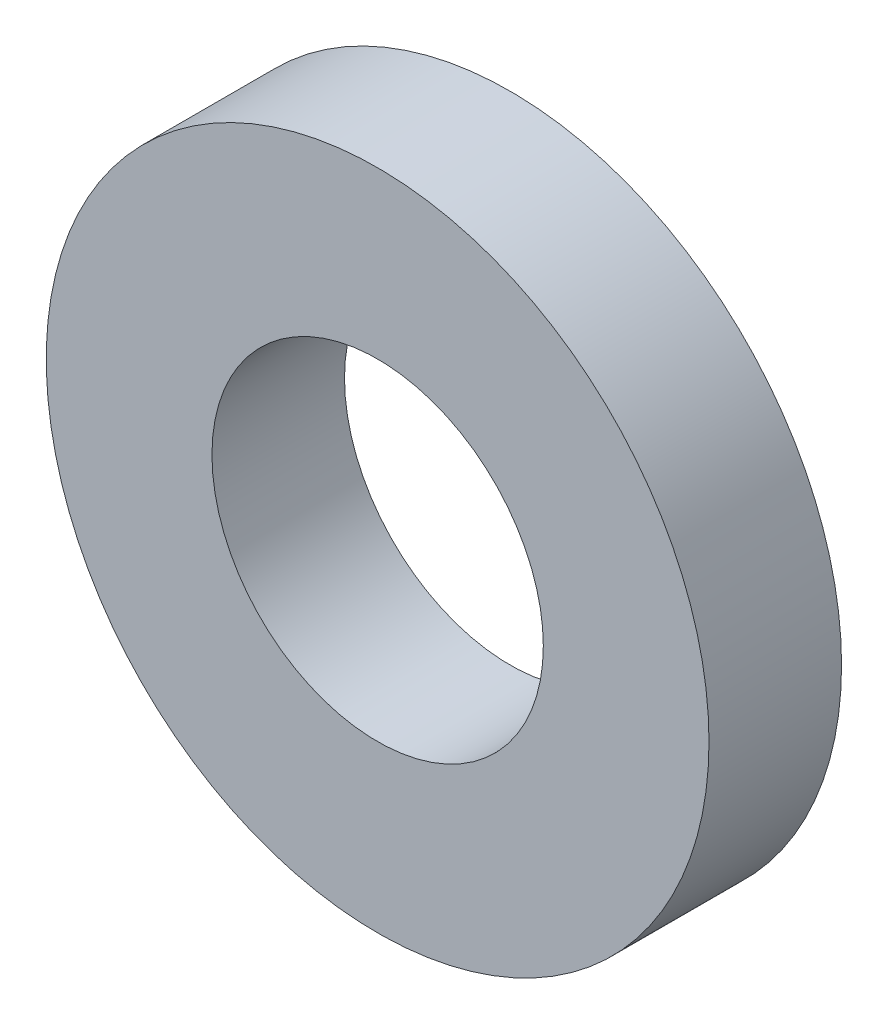
ISO-10303-21;
HEADER;
FILE_DESCRIPTION(('STEP AP214'),'2;1');
FILE_NAME('part.step','',(''),(''),'','','');
FILE_SCHEMA(('AUTOMOTIVE_DESIGN { 1 0 10303 214 1 1 1 1 }'));
ENDSEC;
DATA;
#1=APPLICATION_CONTEXT('core data for automotive mechanical design processes');
#2=APPLICATION_PROTOCOL_DEFINITION('international standard','automotive_design',2000,#1);
#3=PRODUCT_CONTEXT('',#1,'mechanical');
#4=PRODUCT('Part','Part','',(#3));
#5=PRODUCT_RELATED_PRODUCT_CATEGORY('part','',(#4));
#6=PRODUCT_DEFINITION_FORMATION('','',#4);
#7=PRODUCT_DEFINITION_CONTEXT('part definition',#1,'design');
#8=PRODUCT_DEFINITION('design','',#6,#7);
#9=PRODUCT_DEFINITION_SHAPE('','',#8);
#10=(LENGTH_UNIT() NAMED_UNIT(*) SI_UNIT(.MILLI.,.METRE.));
#11=(NAMED_UNIT(*) PLANE_ANGLE_UNIT() SI_UNIT($,.RADIAN.));
#12=(NAMED_UNIT(*) SI_UNIT($,.STERADIAN.) SOLID_ANGLE_UNIT());
#13=UNCERTAINTY_MEASURE_WITH_UNIT(LENGTH_MEASURE(1.E-05),#10,'distance_accuracy_value','');
#14=(GEOMETRIC_REPRESENTATION_CONTEXT(3) GLOBAL_UNCERTAINTY_ASSIGNED_CONTEXT((#13)) GLOBAL_UNIT_ASSIGNED_CONTEXT((#10,
#11,#12)) REPRESENTATION_CONTEXT('',''));
#15=CARTESIAN_POINT('',(0.,0.,0.));
#16=DIRECTION('',(0.,0.,1.));
#17=DIRECTION('',(1.,0.,0.));
#18=AXIS2_PLACEMENT_3D('',#15,#16,#17);
#19=CARTESIAN_POINT('',(0.,0.,0.6));
#20=DIRECTION('',(0.,0.,1.));
#21=DIRECTION('',(1.,0.,0.));
#22=AXIS2_PLACEMENT_3D('',#19,#20,#21);
#23=PLANE('',#22);
#24=CARTESIAN_POINT('',(0.,0.,0.6));
#25=DIRECTION('',(0.,0.,1.));
#26=DIRECTION('',(1.,0.,0.));
#27=AXIS2_PLACEMENT_3D('',#24,#25,#26);
#28=CIRCLE('',#27,3.);
#29=CARTESIAN_POINT('',(3.,0.,0.6));
#30=VERTEX_POINT('',#29);
#31=EDGE_CURVE('E10',#30,#30,#28,.T.);
#32=ORIENTED_EDGE('',*,*,#31,.T.);
#33=EDGE_LOOP('',(#32));
#34=FACE_BOUND('',#33,.T.);
#35=CARTESIAN_POINT('',(0.,0.,0.6));
#36=DIRECTION('',(0.,0.,1.));
#37=DIRECTION('',(1.,0.,0.));
#38=AXIS2_PLACEMENT_3D('',#35,#36,#37);
#39=CIRCLE('',#38,1.5);
#40=CARTESIAN_POINT('',(1.5,0.,0.6));
#41=VERTEX_POINT('',#40);
#42=EDGE_CURVE('E48',#41,#41,#39,.T.);
#43=ORIENTED_EDGE('',*,*,#42,.F.);
#44=EDGE_LOOP('',(#43));
#45=FACE_BOUND('',#44,.T.);
#46=ADVANCED_FACE('F37',(#34,#45),#23,.T.);
#47=CARTESIAN_POINT('',(0.,0.,-0.6));
#48=DIRECTION('',(0.,0.,1.));
#49=DIRECTION('',(1.,0.,0.));
#50=AXIS2_PLACEMENT_3D('',#47,#48,#49);
#51=PLANE('',#50);
#52=CARTESIAN_POINT('',(0.,0.,-0.6));
#53=DIRECTION('',(0.,0.,1.));
#54=DIRECTION('',(1.,0.,0.));
#55=AXIS2_PLACEMENT_3D('',#52,#53,#54);
#56=CIRCLE('',#55,3.);
#57=CARTESIAN_POINT('',(3.,0.,-0.6));
#58=VERTEX_POINT('',#57);
#59=EDGE_CURVE('E41',#58,#58,#56,.T.);
#60=ORIENTED_EDGE('',*,*,#59,.F.);
#61=EDGE_LOOP('',(#60));
#62=FACE_BOUND('',#61,.T.);
#63=CARTESIAN_POINT('',(0.,0.,-0.6));
#64=DIRECTION('',(0.,0.,1.));
#65=DIRECTION('',(1.,0.,0.));
#66=AXIS2_PLACEMENT_3D('',#63,#64,#65);
#67=CIRCLE('',#66,1.5);
#68=CARTESIAN_POINT('',(1.5,0.,-0.6));
#69=VERTEX_POINT('',#68);
#70=EDGE_CURVE('E50',#69,#69,#67,.T.);
#71=ORIENTED_EDGE('',*,*,#70,.T.);
#72=EDGE_LOOP('',(#71));
#73=FACE_BOUND('',#72,.T.);
#74=ADVANCED_FACE('F60',(#62,#73),#51,.F.);
#75=CARTESIAN_POINT('',(0.,0.,0.6));
#76=DIRECTION('',(0.,0.,-1.));
#77=DIRECTION('',(-1.,0.,0.));
#78=AXIS2_PLACEMENT_3D('',#75,#76,#77);
#79=CYLINDRICAL_SURFACE('',#78,3.);
#80=ORIENTED_EDGE('',*,*,#31,.F.);
#81=EDGE_LOOP('',(#80));
#82=FACE_BOUND('',#81,.T.);
#83=ORIENTED_EDGE('',*,*,#59,.T.);
#84=EDGE_LOOP('',(#83));
#85=FACE_BOUND('',#84,.T.);
#86=ADVANCED_FACE('F39',(#82,#85),#79,.T.);
#87=CARTESIAN_POINT('',(0.,0.,0.6));
#88=DIRECTION('',(0.,0.,-1.));
#89=DIRECTION('',(-1.,0.,0.));
#90=AXIS2_PLACEMENT_3D('',#87,#88,#89);
#91=CYLINDRICAL_SURFACE('',#90,1.5);
#92=ORIENTED_EDGE('',*,*,#42,.T.);
#93=EDGE_LOOP('',(#92));
#94=FACE_BOUND('',#93,.T.);
#95=ORIENTED_EDGE('',*,*,#70,.F.);
#96=EDGE_LOOP('',(#95));
#97=FACE_BOUND('',#96,.T.);
#98=ADVANCED_FACE('F56',(#94,#97),#91,.F.);
#99=CLOSED_SHELL('',(#46,#74,#86,#98));
#100=MANIFOLD_SOLID_BREP('B2',#99);
#101=ADVANCED_BREP_SHAPE_REPRESENTATION('',(#18,#100),#14);
#102=SHAPE_DEFINITION_REPRESENTATION(#9,#101);
ENDSEC;
END-ISO-10303-21;
